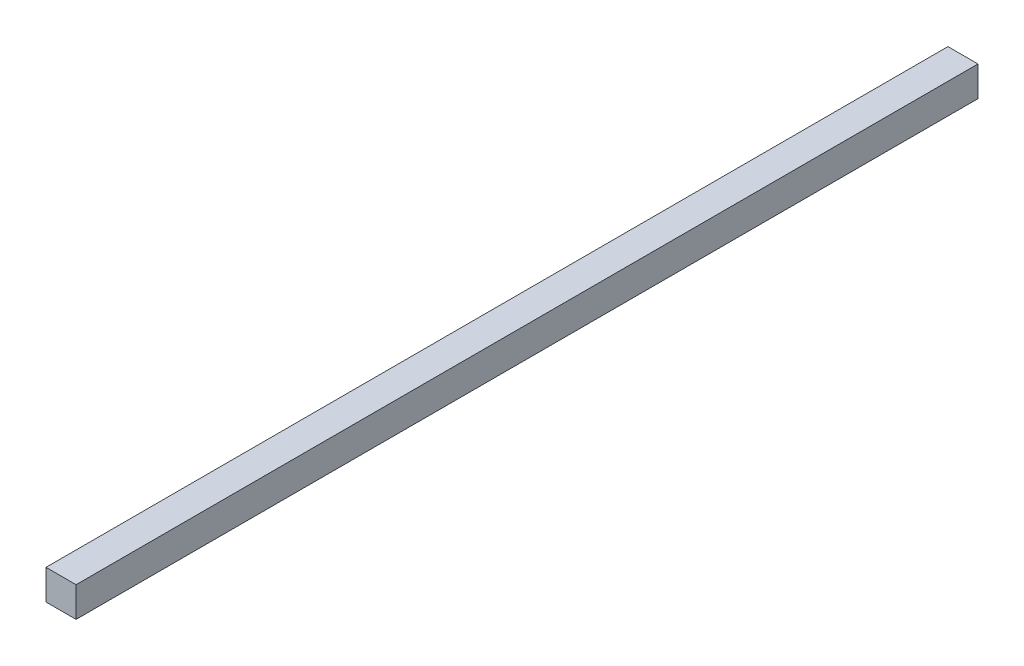
ISO-10303-21;
HEADER;
FILE_DESCRIPTION(('STEP AP214'),'2;1');
FILE_NAME('part.step','',(''),(''),'','','');
FILE_SCHEMA(('AUTOMOTIVE_DESIGN { 1 0 10303 214 1 1 1 1 }'));
ENDSEC;
DATA;
#1=APPLICATION_CONTEXT('core data for automotive mechanical design processes');
#2=APPLICATION_PROTOCOL_DEFINITION('international standard','automotive_design',2000,#1);
#3=PRODUCT_CONTEXT('',#1,'mechanical');
#4=PRODUCT('Part','Part','',(#3));
#5=PRODUCT_RELATED_PRODUCT_CATEGORY('part','',(#4));
#6=PRODUCT_DEFINITION_FORMATION('','',#4);
#7=PRODUCT_DEFINITION_CONTEXT('part definition',#1,'design');
#8=PRODUCT_DEFINITION('design','',#6,#7);
#9=PRODUCT_DEFINITION_SHAPE('','',#8);
#10=(LENGTH_UNIT() NAMED_UNIT(*) SI_UNIT(.MILLI.,.METRE.));
#11=(NAMED_UNIT(*) PLANE_ANGLE_UNIT() SI_UNIT($,.RADIAN.));
#12=(NAMED_UNIT(*) SI_UNIT($,.STERADIAN.) SOLID_ANGLE_UNIT());
#13=UNCERTAINTY_MEASURE_WITH_UNIT(LENGTH_MEASURE(1.E-05),#10,'distance_accuracy_value','');
#14=(GEOMETRIC_REPRESENTATION_CONTEXT(3) GLOBAL_UNCERTAINTY_ASSIGNED_CONTEXT((#13)) GLOBAL_UNIT_ASSIGNED_CONTEXT((#10,
#11,#12)) REPRESENTATION_CONTEXT('',''));
#15=CARTESIAN_POINT('',(0.,0.,0.));
#16=DIRECTION('',(0.,0.,1.));
#17=DIRECTION('',(1.,0.,0.));
#18=AXIS2_PLACEMENT_3D('',#15,#16,#17);
#19=CARTESIAN_POINT('',(15.,-15.,900.));
#20=DIRECTION('',(-1.,0.,0.));
#21=DIRECTION('',(0.,0.,1.));
#22=AXIS2_PLACEMENT_3D('',#19,#20,#21);
#23=PLANE('',#22);
#24=DIRECTION('',(0.,1.,0.));
#25=VECTOR('',#24,1.);
#26=CARTESIAN_POINT('',(15.,-15.,0.));
#27=LINE('',#26,#25);
#28=CARTESIAN_POINT('',(15.,-15.,0.));
#29=VERTEX_POINT('',#28);
#30=CARTESIAN_POINT('',(15.,15.,0.));
#31=VERTEX_POINT('',#30);
#32=EDGE_CURVE('E107',#29,#31,#27,.T.);
#33=ORIENTED_EDGE('',*,*,#32,.T.);
#34=DIRECTION('',(0.,0.,-1.));
#35=VECTOR('',#34,1.);
#36=CARTESIAN_POINT('',(15.,15.,900.));
#37=LINE('',#36,#35);
#38=CARTESIAN_POINT('',(15.,15.,900.));
#39=VERTEX_POINT('',#38);
#40=EDGE_CURVE('E11',#39,#31,#37,.T.);
#41=ORIENTED_EDGE('',*,*,#40,.F.);
#42=DIRECTION('',(0.,1.,0.));
#43=VECTOR('',#42,1.);
#44=CARTESIAN_POINT('',(15.,-15.,900.));
#45=LINE('',#44,#43);
#46=CARTESIAN_POINT('',(15.,-15.,900.));
#47=VERTEX_POINT('',#46);
#48=EDGE_CURVE('E91',#47,#39,#45,.T.);
#49=ORIENTED_EDGE('',*,*,#48,.F.);
#50=DIRECTION('',(0.,0.,-1.));
#51=VECTOR('',#50,1.);
#52=CARTESIAN_POINT('',(15.,-15.,900.));
#53=LINE('',#52,#51);
#54=EDGE_CURVE('E103',#47,#29,#53,.T.);
#55=ORIENTED_EDGE('',*,*,#54,.T.);
#56=EDGE_LOOP('',(#33,#41,#49,#55));
#57=FACE_BOUND('',#56,.T.);
#58=ADVANCED_FACE('F39',(#57),#23,.F.);
#59=CARTESIAN_POINT('',(-15.,15.,900.));
#60=DIRECTION('',(0.,-1.,0.));
#61=DIRECTION('',(0.,0.,-1.));
#62=AXIS2_PLACEMENT_3D('',#59,#60,#61);
#63=PLANE('',#62);
#64=DIRECTION('',(-1.,0.,0.));
#65=VECTOR('',#64,1.);
#66=CARTESIAN_POINT('',(-15.,15.,0.));
#67=LINE('',#66,#65);
#68=CARTESIAN_POINT('',(-15.,15.,0.));
#69=VERTEX_POINT('',#68);
#70=EDGE_CURVE('E96',#31,#69,#67,.T.);
#71=ORIENTED_EDGE('',*,*,#70,.T.);
#72=DIRECTION('',(0.,0.,-1.));
#73=VECTOR('',#72,1.);
#74=CARTESIAN_POINT('',(-15.,15.,900.));
#75=LINE('',#74,#73);
#76=CARTESIAN_POINT('',(-15.,15.,900.));
#77=VERTEX_POINT('',#76);
#78=EDGE_CURVE('E48',#77,#69,#75,.T.);
#79=ORIENTED_EDGE('',*,*,#78,.F.);
#80=DIRECTION('',(-1.,0.,0.));
#81=VECTOR('',#80,1.);
#82=CARTESIAN_POINT('',(-15.,15.,900.));
#83=LINE('',#82,#81);
#84=EDGE_CURVE('E86',#39,#77,#83,.T.);
#85=ORIENTED_EDGE('',*,*,#84,.F.);
#86=ORIENTED_EDGE('',*,*,#40,.T.);
#87=EDGE_LOOP('',(#71,#79,#85,#86));
#88=FACE_BOUND('',#87,.T.);
#89=ADVANCED_FACE('F95',(#88),#63,.F.);
#90=CARTESIAN_POINT('',(-15.,-15.,900.));
#91=DIRECTION('',(1.,0.,0.));
#92=DIRECTION('',(0.,0.,-1.));
#93=AXIS2_PLACEMENT_3D('',#90,#91,#92);
#94=PLANE('',#93);
#95=DIRECTION('',(0.,-1.,0.));
#96=VECTOR('',#95,1.);
#97=CARTESIAN_POINT('',(-15.,-15.,0.));
#98=LINE('',#97,#96);
#99=CARTESIAN_POINT('',(-15.,-15.,0.));
#100=VERTEX_POINT('',#99);
#101=EDGE_CURVE('E73',#69,#100,#98,.T.);
#102=ORIENTED_EDGE('',*,*,#101,.T.);
#103=DIRECTION('',(0.,0.,-1.));
#104=VECTOR('',#103,1.);
#105=CARTESIAN_POINT('',(-15.,-15.,900.));
#106=LINE('',#105,#104);
#107=CARTESIAN_POINT('',(-15.,-15.,900.));
#108=VERTEX_POINT('',#107);
#109=EDGE_CURVE('E98',#108,#100,#106,.T.);
#110=ORIENTED_EDGE('',*,*,#109,.F.);
#111=DIRECTION('',(0.,-1.,0.));
#112=VECTOR('',#111,1.);
#113=CARTESIAN_POINT('',(-15.,-15.,900.));
#114=LINE('',#113,#112);
#115=EDGE_CURVE('E89',#77,#108,#114,.T.);
#116=ORIENTED_EDGE('',*,*,#115,.F.);
#117=ORIENTED_EDGE('',*,*,#78,.T.);
#118=EDGE_LOOP('',(#102,#110,#116,#117));
#119=FACE_BOUND('',#118,.T.);
#120=ADVANCED_FACE('F99',(#119),#94,.F.);
#121=CARTESIAN_POINT('',(-15.,-15.,900.));
#122=DIRECTION('',(0.,1.,0.));
#123=DIRECTION('',(0.,0.,1.));
#124=AXIS2_PLACEMENT_3D('',#121,#122,#123);
#125=PLANE('',#124);
#126=DIRECTION('',(1.,0.,0.));
#127=VECTOR('',#126,1.);
#128=CARTESIAN_POINT('',(-15.,-15.,0.));
#129=LINE('',#128,#127);
#130=EDGE_CURVE('E79',#100,#29,#129,.T.);
#131=ORIENTED_EDGE('',*,*,#130,.T.);
#132=ORIENTED_EDGE('',*,*,#54,.F.);
#133=DIRECTION('',(1.,0.,0.));
#134=VECTOR('',#133,1.);
#135=CARTESIAN_POINT('',(-15.,-15.,900.));
#136=LINE('',#135,#134);
#137=EDGE_CURVE('E56',#108,#47,#136,.T.);
#138=ORIENTED_EDGE('',*,*,#137,.F.);
#139=ORIENTED_EDGE('',*,*,#109,.T.);
#140=EDGE_LOOP('',(#131,#132,#138,#139));
#141=FACE_BOUND('',#140,.T.);
#142=ADVANCED_FACE('F120',(#141),#125,.F.);
#143=CARTESIAN_POINT('',(0.,0.,900.));
#144=DIRECTION('',(0.,0.,-1.));
#145=DIRECTION('',(-1.,0.,0.));
#146=AXIS2_PLACEMENT_3D('',#143,#144,#145);
#147=PLANE('',#146);
#148=ORIENTED_EDGE('',*,*,#48,.T.);
#149=ORIENTED_EDGE('',*,*,#84,.T.);
#150=ORIENTED_EDGE('',*,*,#115,.T.);
#151=ORIENTED_EDGE('',*,*,#137,.T.);
#152=EDGE_LOOP('',(#148,#149,#150,#151));
#153=FACE_BOUND('',#152,.T.);
#154=ADVANCED_FACE('F87',(#153),#147,.F.);
#155=CARTESIAN_POINT('',(0.,0.,0.));
#156=DIRECTION('',(0.,0.,-1.));
#157=DIRECTION('',(-1.,0.,0.));
#158=AXIS2_PLACEMENT_3D('',#155,#156,#157);
#159=PLANE('',#158);
#160=ORIENTED_EDGE('',*,*,#32,.F.);
#161=ORIENTED_EDGE('',*,*,#130,.F.);
#162=ORIENTED_EDGE('',*,*,#101,.F.);
#163=ORIENTED_EDGE('',*,*,#70,.F.);
#164=EDGE_LOOP('',(#160,#161,#162,#163));
#165=FACE_BOUND('',#164,.T.);
#166=ADVANCED_FACE('F123',(#165),#159,.T.);
#167=CLOSED_SHELL('',(#58,#89,#120,#142,#154,#166));
#168=MANIFOLD_SOLID_BREP('B2',#167);
#169=ADVANCED_BREP_SHAPE_REPRESENTATION('',(#18,#168),#14);
#170=SHAPE_DEFINITION_REPRESENTATION(#9,#169);
ENDSEC;
END-ISO-10303-21;
